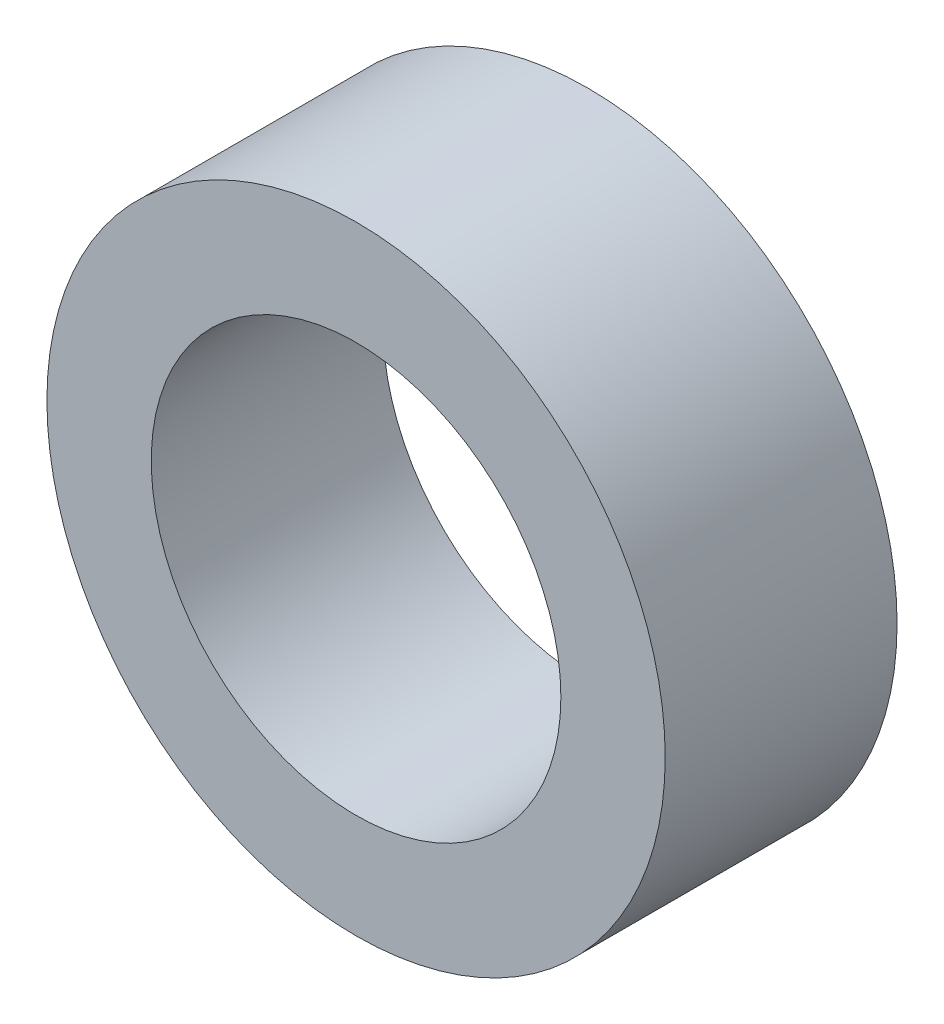
ISO-10303-21;
HEADER;
FILE_DESCRIPTION(('STEP AP214'),'2;1');
FILE_NAME('part.step','',(''),(''),'','','');
FILE_SCHEMA(('AUTOMOTIVE_DESIGN { 1 0 10303 214 1 1 1 1 }'));
ENDSEC;
DATA;
#1=APPLICATION_CONTEXT('core data for automotive mechanical design processes');
#2=APPLICATION_PROTOCOL_DEFINITION('international standard','automotive_design',2000,#1);
#3=PRODUCT_CONTEXT('',#1,'mechanical');
#4=PRODUCT('Part','Part','',(#3));
#5=PRODUCT_RELATED_PRODUCT_CATEGORY('part','',(#4));
#6=PRODUCT_DEFINITION_FORMATION('','',#4);
#7=PRODUCT_DEFINITION_CONTEXT('part definition',#1,'design');
#8=PRODUCT_DEFINITION('design','',#6,#7);
#9=PRODUCT_DEFINITION_SHAPE('','',#8);
#10=(LENGTH_UNIT() NAMED_UNIT(*) SI_UNIT(.MILLI.,.METRE.));
#11=(NAMED_UNIT(*) PLANE_ANGLE_UNIT() SI_UNIT($,.RADIAN.));
#12=(NAMED_UNIT(*) SI_UNIT($,.STERADIAN.) SOLID_ANGLE_UNIT());
#13=UNCERTAINTY_MEASURE_WITH_UNIT(LENGTH_MEASURE(1.E-05),#10,'distance_accuracy_value','');
#14=(GEOMETRIC_REPRESENTATION_CONTEXT(3) GLOBAL_UNCERTAINTY_ASSIGNED_CONTEXT((#13)) GLOBAL_UNIT_ASSIGNED_CONTEXT((#10,
#11,#12)) REPRESENTATION_CONTEXT('',''));
#15=CARTESIAN_POINT('',(0.,0.,0.));
#16=DIRECTION('',(0.,0.,1.));
#17=DIRECTION('',(1.,0.,0.));
#18=AXIS2_PLACEMENT_3D('',#15,#16,#17);
#19=CARTESIAN_POINT('',(0.,0.,1.5));
#20=DIRECTION('',(0.,0.,1.));
#21=DIRECTION('',(1.,0.,0.));
#22=AXIS2_PLACEMENT_3D('',#19,#20,#21);
#23=PLANE('',#22);
#24=CARTESIAN_POINT('',(0.,0.,1.5));
#25=DIRECTION('',(0.,0.,1.));
#26=DIRECTION('',(1.,0.,0.));
#27=AXIS2_PLACEMENT_3D('',#24,#25,#26);
#28=CIRCLE('',#27,4.);
#29=CARTESIAN_POINT('',(4.,0.,1.5));
#30=VERTEX_POINT('',#29);
#31=EDGE_CURVE('E10',#30,#30,#28,.T.);
#32=ORIENTED_EDGE('',*,*,#31,.T.);
#33=EDGE_LOOP('',(#32));
#34=FACE_BOUND('',#33,.T.);
#35=CARTESIAN_POINT('',(0.,0.,1.5));
#36=DIRECTION('',(0.,0.,1.));
#37=DIRECTION('',(1.,0.,0.));
#38=AXIS2_PLACEMENT_3D('',#35,#36,#37);
#39=CIRCLE('',#38,2.65);
#40=CARTESIAN_POINT('',(2.65,0.,1.5));
#41=VERTEX_POINT('',#40);
#42=EDGE_CURVE('E40',#41,#41,#39,.T.);
#43=ORIENTED_EDGE('',*,*,#42,.F.);
#44=EDGE_LOOP('',(#43));
#45=FACE_BOUND('',#44,.T.);
#46=ADVANCED_FACE('F29',(#34,#45),#23,.T.);
#47=CARTESIAN_POINT('',(0.,0.,-1.5));
#48=DIRECTION('',(0.,0.,1.));
#49=DIRECTION('',(1.,0.,0.));
#50=AXIS2_PLACEMENT_3D('',#47,#48,#49);
#51=PLANE('',#50);
#52=CARTESIAN_POINT('',(0.,0.,-1.5));
#53=DIRECTION('',(0.,0.,1.));
#54=DIRECTION('',(1.,0.,0.));
#55=AXIS2_PLACEMENT_3D('',#52,#53,#54);
#56=CIRCLE('',#55,4.);
#57=CARTESIAN_POINT('',(4.,0.,-1.5));
#58=VERTEX_POINT('',#57);
#59=EDGE_CURVE('E33',#58,#58,#56,.T.);
#60=ORIENTED_EDGE('',*,*,#59,.F.);
#61=EDGE_LOOP('',(#60));
#62=FACE_BOUND('',#61,.T.);
#63=CARTESIAN_POINT('',(0.,0.,-1.5));
#64=DIRECTION('',(0.,0.,1.));
#65=DIRECTION('',(1.,0.,0.));
#66=AXIS2_PLACEMENT_3D('',#63,#64,#65);
#67=CIRCLE('',#66,2.65);
#68=CARTESIAN_POINT('',(2.65,0.,-1.5));
#69=VERTEX_POINT('',#68);
#70=EDGE_CURVE('E42',#69,#69,#67,.T.);
#71=ORIENTED_EDGE('',*,*,#70,.T.);
#72=EDGE_LOOP('',(#71));
#73=FACE_BOUND('',#72,.T.);
#74=ADVANCED_FACE('F52',(#62,#73),#51,.F.);
#75=CARTESIAN_POINT('',(0.,0.,1.5));
#76=DIRECTION('',(0.,0.,-1.));
#77=DIRECTION('',(-1.,0.,0.));
#78=AXIS2_PLACEMENT_3D('',#75,#76,#77);
#79=CYLINDRICAL_SURFACE('',#78,4.);
#80=ORIENTED_EDGE('',*,*,#31,.F.);
#81=EDGE_LOOP('',(#80));
#82=FACE_BOUND('',#81,.T.);
#83=ORIENTED_EDGE('',*,*,#59,.T.);
#84=EDGE_LOOP('',(#83));
#85=FACE_BOUND('',#84,.T.);
#86=ADVANCED_FACE('F31',(#82,#85),#79,.T.);
#87=CARTESIAN_POINT('',(0.,0.,1.5));
#88=DIRECTION('',(0.,0.,-1.));
#89=DIRECTION('',(-1.,0.,0.));
#90=AXIS2_PLACEMENT_3D('',#87,#88,#89);
#91=CYLINDRICAL_SURFACE('',#90,2.65);
#92=ORIENTED_EDGE('',*,*,#42,.T.);
#93=EDGE_LOOP('',(#92));
#94=FACE_BOUND('',#93,.T.);
#95=ORIENTED_EDGE('',*,*,#70,.F.);
#96=EDGE_LOOP('',(#95));
#97=FACE_BOUND('',#96,.T.);
#98=ADVANCED_FACE('F48',(#94,#97),#91,.F.);
#99=CLOSED_SHELL('',(#46,#74,#86,#98));
#100=MANIFOLD_SOLID_BREP('B2',#99);
#101=ADVANCED_BREP_SHAPE_REPRESENTATION('',(#18,#100),#14);
#102=SHAPE_DEFINITION_REPRESENTATION(#9,#101);
ENDSEC;
END-ISO-10303-21;
